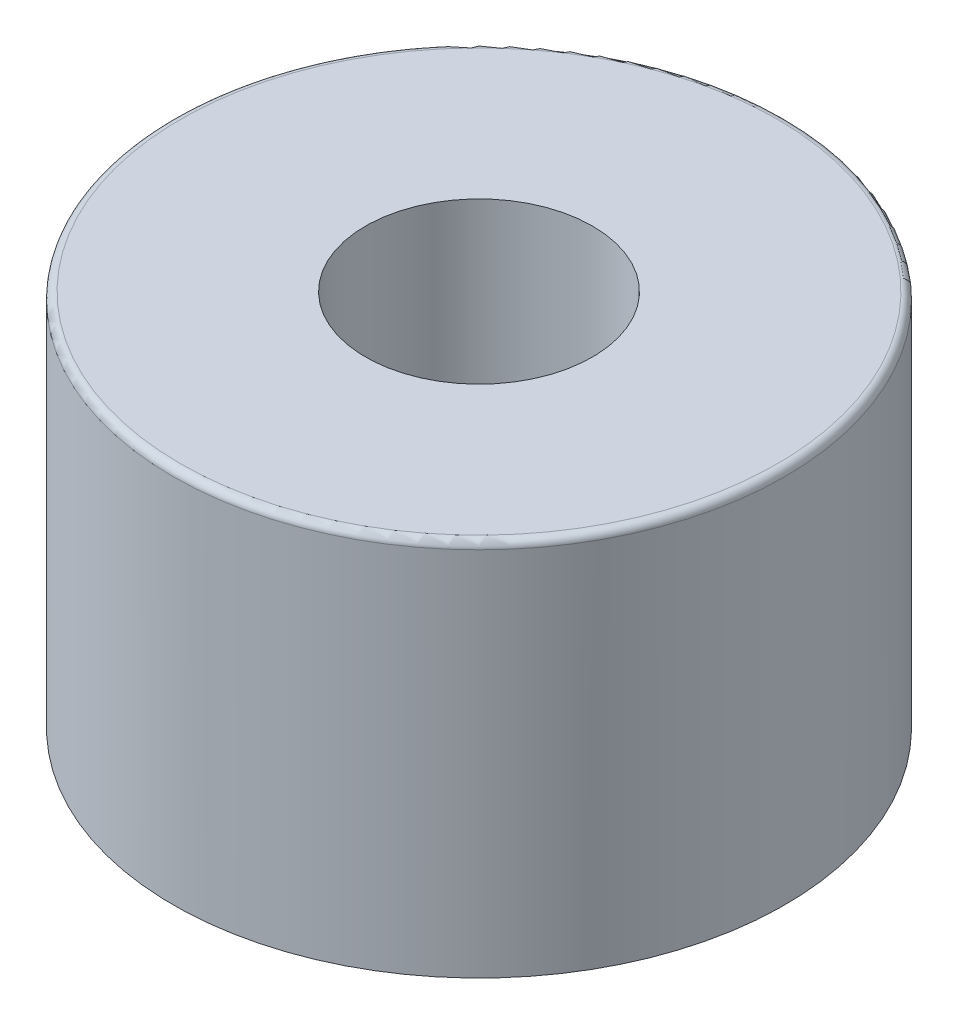
ISO-10303-21;
HEADER;
FILE_DESCRIPTION(('STEP AP214'),'2;1');
FILE_NAME('part.step','',(''),(''),'','','');
FILE_SCHEMA(('AUTOMOTIVE_DESIGN { 1 0 10303 214 1 1 1 1 }'));
ENDSEC;
DATA;
#1=APPLICATION_CONTEXT('core data for automotive mechanical design processes');
#2=APPLICATION_PROTOCOL_DEFINITION('international standard','automotive_design',2000,#1);
#3=PRODUCT_CONTEXT('',#1,'mechanical');
#4=PRODUCT('Part','Part','',(#3));
#5=PRODUCT_RELATED_PRODUCT_CATEGORY('part','',(#4));
#6=PRODUCT_DEFINITION_FORMATION('','',#4);
#7=PRODUCT_DEFINITION_CONTEXT('part definition',#1,'design');
#8=PRODUCT_DEFINITION('design','',#6,#7);
#9=PRODUCT_DEFINITION_SHAPE('','',#8);
#10=(LENGTH_UNIT() NAMED_UNIT(*) SI_UNIT(.MILLI.,.METRE.));
#11=(NAMED_UNIT(*) PLANE_ANGLE_UNIT() SI_UNIT($,.RADIAN.));
#12=(NAMED_UNIT(*) SI_UNIT($,.STERADIAN.) SOLID_ANGLE_UNIT());
#13=UNCERTAINTY_MEASURE_WITH_UNIT(LENGTH_MEASURE(1.E-05),#10,'distance_accuracy_value','');
#14=(GEOMETRIC_REPRESENTATION_CONTEXT(3) GLOBAL_UNCERTAINTY_ASSIGNED_CONTEXT((#13)) GLOBAL_UNIT_ASSIGNED_CONTEXT((#10,
#11,#12)) REPRESENTATION_CONTEXT('',''));
#15=CARTESIAN_POINT('',(0.,0.,0.));
#16=DIRECTION('',(0.,0.,1.));
#17=DIRECTION('',(1.,0.,0.));
#18=AXIS2_PLACEMENT_3D('',#15,#16,#17);
#19=CARTESIAN_POINT('',(0.,15.24,0.));
#20=DIRECTION('',(0.,1.,0.));
#21=DIRECTION('',(0.,0.,1.));
#22=AXIS2_PLACEMENT_3D('',#19,#20,#21);
#23=PLANE('',#22);
#24=CARTESIAN_POINT('',(0.,15.24,0.));
#25=DIRECTION('',(0.,1.,0.));
#26=DIRECTION('',(0.,0.,1.));
#27=AXIS2_PLACEMENT_3D('',#24,#25,#26);
#28=CIRCLE('',#27,12.019);
#29=CARTESIAN_POINT('',(0.,15.24,12.019));
#30=VERTEX_POINT('',#29);
#31=EDGE_CURVE('E39',#30,#30,#28,.T.);
#32=ORIENTED_EDGE('',*,*,#31,.T.);
#33=EDGE_LOOP('',(#32));
#34=FACE_BOUND('',#33,.T.);
#35=CARTESIAN_POINT('',(0.,15.24,0.));
#36=DIRECTION('',(0.,1.,0.));
#37=DIRECTION('',(0.,0.,1.));
#38=AXIS2_PLACEMENT_3D('',#35,#36,#37);
#39=CIRCLE('',#38,4.572);
#40=CARTESIAN_POINT('',(0.,15.24,-4.572));
#41=VERTEX_POINT('',#40);
#42=EDGE_CURVE('E47',#41,#41,#39,.T.);
#43=ORIENTED_EDGE('',*,*,#42,.F.);
#44=EDGE_LOOP('',(#43));
#45=FACE_BOUND('',#44,.T.);
#46=ADVANCED_FACE('F32',(#34,#45),#23,.T.);
#47=CARTESIAN_POINT('',(0.,0.,0.));
#48=DIRECTION('',(0.,1.,0.));
#49=DIRECTION('',(0.,0.,1.));
#50=AXIS2_PLACEMENT_3D('',#47,#48,#49);
#51=PLANE('',#50);
#52=CARTESIAN_POINT('',(0.,0.,0.));
#53=DIRECTION('',(0.,1.,0.));
#54=DIRECTION('',(0.,0.,1.));
#55=AXIS2_PLACEMENT_3D('',#52,#53,#54);
#56=CIRCLE('',#55,12.319);
#57=CARTESIAN_POINT('',(0.,0.,-12.319));
#58=VERTEX_POINT('',#57);
#59=EDGE_CURVE('E43',#58,#58,#56,.T.);
#60=ORIENTED_EDGE('',*,*,#59,.F.);
#61=EDGE_LOOP('',(#60));
#62=FACE_BOUND('',#61,.T.);
#63=CARTESIAN_POINT('',(0.,0.,0.));
#64=DIRECTION('',(0.,1.,0.));
#65=DIRECTION('',(0.,0.,1.));
#66=AXIS2_PLACEMENT_3D('',#63,#64,#65);
#67=CIRCLE('',#66,4.572);
#68=CARTESIAN_POINT('',(0.,0.,-4.572));
#69=VERTEX_POINT('',#68);
#70=EDGE_CURVE('E50',#69,#69,#67,.T.);
#71=ORIENTED_EDGE('',*,*,#70,.T.);
#72=EDGE_LOOP('',(#71));
#73=FACE_BOUND('',#72,.T.);
#74=ADVANCED_FACE('F60',(#62,#73),#51,.F.);
#75=CARTESIAN_POINT('',(0.,15.24,0.));
#76=DIRECTION('',(0.,-1.,0.));
#77=DIRECTION('',(0.,0.,-1.));
#78=AXIS2_PLACEMENT_3D('',#75,#76,#77);
#79=CYLINDRICAL_SURFACE('',#78,12.319);
#80=CARTESIAN_POINT('',(0.,14.94,0.));
#81=DIRECTION('',(0.,1.,0.));
#82=DIRECTION('',(0.,0.,1.));
#83=AXIS2_PLACEMENT_3D('',#80,#81,#82);
#84=CIRCLE('',#83,12.319);
#85=CARTESIAN_POINT('',(0.,14.94,-12.319));
#86=VERTEX_POINT('',#85);
#87=EDGE_CURVE('E10',#86,#86,#84,.F.);
#88=CARTESIAN_POINT('',(0.,14.94,-12.319));
#89=CARTESIAN_POINT('',(0.,14.784375,-12.319));
#90=CARTESIAN_POINT('',(0.,14.62875,-12.319));
#91=CARTESIAN_POINT('',(0.,14.3175,-12.319));
#92=CARTESIAN_POINT('',(0.,14.161875,-12.319));
#93=CARTESIAN_POINT('',(0.,13.850625,-12.319));
#94=CARTESIAN_POINT('',(0.,13.695,-12.319));
#95=CARTESIAN_POINT('',(0.,13.38375,-12.319));
#96=CARTESIAN_POINT('',(0.,13.228125,-12.319));
#97=CARTESIAN_POINT('',(0.,12.916875,-12.319));
#98=CARTESIAN_POINT('',(0.,12.76125,-12.319));
#99=CARTESIAN_POINT('',(0.,12.45,-12.319));
#100=CARTESIAN_POINT('',(0.,12.294375,-12.319));
#101=CARTESIAN_POINT('',(0.,11.983125,-12.319));
#102=CARTESIAN_POINT('',(0.,11.8275,-12.319));
#103=CARTESIAN_POINT('',(0.,11.51625,-12.319));
#104=CARTESIAN_POINT('',(0.,11.360625,-12.319));
#105=CARTESIAN_POINT('',(0.,11.049375,-12.319));
#106=CARTESIAN_POINT('',(0.,10.89375,-12.319));
#107=CARTESIAN_POINT('',(0.,10.5825,-12.319));
#108=CARTESIAN_POINT('',(0.,10.426875,-12.319));
#109=CARTESIAN_POINT('',(0.,10.115625,-12.319));
#110=CARTESIAN_POINT('',(0.,9.96,-12.319));
#111=CARTESIAN_POINT('',(0.,9.64875,-12.319));
#112=CARTESIAN_POINT('',(0.,9.493125,-12.319));
#113=CARTESIAN_POINT('',(0.,9.181875,-12.319));
#114=CARTESIAN_POINT('',(0.,9.02625,-12.319));
#115=CARTESIAN_POINT('',(0.,8.715,-12.319));
#116=CARTESIAN_POINT('',(0.,8.559375,-12.319));
#117=CARTESIAN_POINT('',(0.,8.248125,-12.319));
#118=CARTESIAN_POINT('',(0.,8.0925,-12.319));
#119=CARTESIAN_POINT('',(0.,7.78125,-12.319));
#120=CARTESIAN_POINT('',(0.,7.625625,-12.319));
#121=CARTESIAN_POINT('',(0.,7.314375,-12.319));
#122=CARTESIAN_POINT('',(0.,7.15875,-12.319));
#123=CARTESIAN_POINT('',(0.,6.8475,-12.319));
#124=CARTESIAN_POINT('',(0.,6.691875,-12.319));
#125=CARTESIAN_POINT('',(0.,6.380625,-12.319));
#126=CARTESIAN_POINT('',(0.,6.225,-12.319));
#127=CARTESIAN_POINT('',(0.,5.91375,-12.319));
#128=CARTESIAN_POINT('',(0.,5.758125,-12.319));
#129=CARTESIAN_POINT('',(0.,5.446875,-12.319));
#130=CARTESIAN_POINT('',(0.,5.29125,-12.319));
#131=CARTESIAN_POINT('',(0.,4.98,-12.319));
#132=CARTESIAN_POINT('',(0.,4.824375,-12.319));
#133=CARTESIAN_POINT('',(0.,4.513125,-12.319));
#134=CARTESIAN_POINT('',(0.,4.3575,-12.319));
#135=CARTESIAN_POINT('',(0.,4.04625,-12.319));
#136=CARTESIAN_POINT('',(0.,3.890625,-12.319));
#137=CARTESIAN_POINT('',(0.,3.579375,-12.319));
#138=CARTESIAN_POINT('',(0.,3.42375,-12.319));
#139=CARTESIAN_POINT('',(0.,3.1125,-12.319));
#140=CARTESIAN_POINT('',(0.,2.956875,-12.319));
#141=CARTESIAN_POINT('',(0.,2.645625,-12.319));
#142=CARTESIAN_POINT('',(0.,2.49,-12.319));
#143=CARTESIAN_POINT('',(0.,2.17875,-12.319));
#144=CARTESIAN_POINT('',(0.,2.023125,-12.319));
#145=CARTESIAN_POINT('',(0.,1.711875,-12.319));
#146=CARTESIAN_POINT('',(0.,1.55625,-12.319));
#147=CARTESIAN_POINT('',(0.,1.245,-12.319));
#148=CARTESIAN_POINT('',(0.,1.089375,-12.319));
#149=CARTESIAN_POINT('',(0.,0.778125,-12.319));
#150=CARTESIAN_POINT('',(0.,0.6225,-12.319));
#151=CARTESIAN_POINT('',(0.,0.31125,-12.319));
#152=CARTESIAN_POINT('',(0.,0.155625,-12.319));
#153=CARTESIAN_POINT('',(0.,0.,-12.319));
#154=B_SPLINE_CURVE_WITH_KNOTS('',3,(#88,#89,#90,#91,#92,#93,#94,#95,#96,#97,#98,#99,#100,#101,
#102,#103,#104,#105,#106,#107,#108,#109,#110,#111,#112,#113,#114,#115,#116,#117,#118,#119,#120,
#121,#122,#123,#124,#125,#126,#127,#128,#129,#130,#131,#132,#133,#134,#135,#136,#137,#138,#139,
#140,#141,#142,#143,#144,#145,#146,#147,#148,#149,#150,#151,#152,#153),.UNSPECIFIED.,.F.,.F.,(4,
2,2,2,2,2,2,2,2,2,2,2,2,2,2,2,2,2,2,2,2,2,2,2,2,2,2,2,2,2,2,2,4),(0.,0.466874999999999,
0.933749999999999,1.400625,1.8675,2.334375,2.80125,3.268125,3.735,4.201875,4.66875,5.135625,
5.6025,6.069375,6.53625,7.003125,7.47,7.936875,8.40375,8.870625,9.3375,9.804375,10.27125,
10.738125,11.205,11.671875,12.13875,12.605625,13.0725,13.539375,14.00625,14.473125,14.94),.UNSPECIFIED.);
#155=EDGE_CURVE('BSEAM65',#86,#58,#154,.T.);
#156=ORIENTED_EDGE('',*,*,#87,.T.);
#157=ORIENTED_EDGE('',*,*,#59,.T.);
#158=ORIENTED_EDGE('',*,*,#155,.T.);
#159=ORIENTED_EDGE('',*,*,#155,.F.);
#160=EDGE_LOOP('',(#156,#158,#157,#159));
#161=FACE_BOUND('',#160,.T.);
#162=ADVANCED_FACE('F65',(#161),#79,.T.);
#163=CARTESIAN_POINT('',(0.,15.24,0.));
#164=DIRECTION('',(0.,-1.,0.));
#165=DIRECTION('',(0.,0.,-1.));
#166=AXIS2_PLACEMENT_3D('',#163,#164,#165);
#167=CYLINDRICAL_SURFACE('',#166,4.572);
#168=CARTESIAN_POINT('',(0.,15.24,-4.572));
#169=CARTESIAN_POINT('',(0.,15.08125,-4.572));
#170=CARTESIAN_POINT('',(0.,14.9225,-4.572));
#171=CARTESIAN_POINT('',(0.,14.605,-4.572));
#172=CARTESIAN_POINT('',(0.,14.44625,-4.572));
#173=CARTESIAN_POINT('',(0.,14.12875,-4.572));
#174=CARTESIAN_POINT('',(0.,13.97,-4.572));
#175=CARTESIAN_POINT('',(0.,13.6525,-4.572));
#176=CARTESIAN_POINT('',(0.,13.49375,-4.572));
#177=CARTESIAN_POINT('',(0.,13.17625,-4.572));
#178=CARTESIAN_POINT('',(0.,13.0175,-4.572));
#179=CARTESIAN_POINT('',(0.,12.7,-4.572));
#180=CARTESIAN_POINT('',(0.,12.54125,-4.572));
#181=CARTESIAN_POINT('',(0.,12.22375,-4.572));
#182=CARTESIAN_POINT('',(0.,12.065,-4.572));
#183=CARTESIAN_POINT('',(0.,11.7475,-4.572));
#184=CARTESIAN_POINT('',(0.,11.58875,-4.572));
#185=CARTESIAN_POINT('',(0.,11.27125,-4.572));
#186=CARTESIAN_POINT('',(0.,11.1125,-4.572));
#187=CARTESIAN_POINT('',(0.,10.795,-4.572));
#188=CARTESIAN_POINT('',(0.,10.63625,-4.572));
#189=CARTESIAN_POINT('',(0.,10.31875,-4.572));
#190=CARTESIAN_POINT('',(0.,10.16,-4.572));
#191=CARTESIAN_POINT('',(0.,9.8425,-4.572));
#192=CARTESIAN_POINT('',(0.,9.68375,-4.572));
#193=CARTESIAN_POINT('',(0.,9.36625,-4.572));
#194=CARTESIAN_POINT('',(0.,9.2075,-4.572));
#195=CARTESIAN_POINT('',(0.,8.89,-4.572));
#196=CARTESIAN_POINT('',(0.,8.73125,-4.572));
#197=CARTESIAN_POINT('',(0.,8.41375,-4.572));
#198=CARTESIAN_POINT('',(0.,8.255,-4.572));
#199=CARTESIAN_POINT('',(0.,7.9375,-4.572));
#200=CARTESIAN_POINT('',(0.,7.77875,-4.572));
#201=CARTESIAN_POINT('',(0.,7.46125,-4.572));
#202=CARTESIAN_POINT('',(0.,7.3025,-4.572));
#203=CARTESIAN_POINT('',(0.,6.985,-4.572));
#204=CARTESIAN_POINT('',(0.,6.82625,-4.572));
#205=CARTESIAN_POINT('',(0.,6.50875,-4.572));
#206=CARTESIAN_POINT('',(0.,6.35,-4.572));
#207=CARTESIAN_POINT('',(0.,6.0325,-4.572));
#208=CARTESIAN_POINT('',(0.,5.87375,-4.572));
#209=CARTESIAN_POINT('',(0.,5.55625,-4.572));
#210=CARTESIAN_POINT('',(0.,5.3975,-4.572));
#211=CARTESIAN_POINT('',(0.,5.08,-4.572));
#212=CARTESIAN_POINT('',(0.,4.92125,-4.572));
#213=CARTESIAN_POINT('',(0.,4.60375,-4.572));
#214=CARTESIAN_POINT('',(0.,4.445,-4.572));
#215=CARTESIAN_POINT('',(0.,4.1275,-4.572));
#216=CARTESIAN_POINT('',(0.,3.96875,-4.572));
#217=CARTESIAN_POINT('',(0.,3.65125,-4.572));
#218=CARTESIAN_POINT('',(0.,3.4925,-4.572));
#219=CARTESIAN_POINT('',(0.,3.175,-4.572));
#220=CARTESIAN_POINT('',(0.,3.01625,-4.572));
#221=CARTESIAN_POINT('',(0.,2.69875,-4.572));
#222=CARTESIAN_POINT('',(0.,2.54,-4.572));
#223=CARTESIAN_POINT('',(0.,2.2225,-4.572));
#224=CARTESIAN_POINT('',(0.,2.06375,-4.572));
#225=CARTESIAN_POINT('',(0.,1.74625,-4.572));
#226=CARTESIAN_POINT('',(0.,1.5875,-4.572));
#227=CARTESIAN_POINT('',(0.,1.27,-4.572));
#228=CARTESIAN_POINT('',(0.,1.11125,-4.572));
#229=CARTESIAN_POINT('',(0.,0.79375,-4.572));
#230=CARTESIAN_POINT('',(0.,0.634999999999999,-4.572));
#231=CARTESIAN_POINT('',(0.,0.3175,-4.572));
#232=CARTESIAN_POINT('',(0.,0.15875,-4.572));
#233=CARTESIAN_POINT('',(0.,0.,-4.572));
#234=B_SPLINE_CURVE_WITH_KNOTS('',3,(#168,#169,#170,#171,#172,#173,#174,#175,#176,#177,#178,
#179,#180,#181,#182,#183,#184,#185,#186,#187,#188,#189,#190,#191,#192,#193,#194,#195,#196,#197,
#198,#199,#200,#201,#202,#203,#204,#205,#206,#207,#208,#209,#210,#211,#212,#213,#214,#215,#216,
#217,#218,#219,#220,#221,#222,#223,#224,#225,#226,#227,#228,#229,#230,#231,#232,#233),
.UNSPECIFIED.,.F.,.F.,(4,2,2,2,2,2,2,2,2,2,2,2,2,2,2,2,2,2,2,2,2,2,2,2,2,2,2,2,2,2,2,2,4),(0.,
0.476250000000001,0.9525,1.42875,1.905,2.38125,2.8575,3.33375,3.81,4.28625,4.7625,5.23875,5.715,
6.19125,6.6675,7.14375,7.62,8.09625,8.5725,9.04875,9.525,10.00125,10.4775,10.95375,11.43,
11.90625,12.3825,12.85875,13.335,13.81125,14.2875,14.76375,15.24),.UNSPECIFIED.);
#235=EDGE_CURVE('BSEAM56',#41,#69,#234,.T.);
#236=ORIENTED_EDGE('',*,*,#42,.T.);
#237=ORIENTED_EDGE('',*,*,#70,.F.);
#238=ORIENTED_EDGE('',*,*,#235,.T.);
#239=ORIENTED_EDGE('',*,*,#235,.F.);
#240=EDGE_LOOP('',(#236,#238,#237,#239));
#241=FACE_BOUND('',#240,.T.);
#242=ADVANCED_FACE('F56',(#241),#167,.F.);
#243=CARTESIAN_POINT('',(0.,14.94,0.));
#244=DIRECTION('',(0.,1.,0.));
#245=DIRECTION('',(0.,0.,1.));
#246=AXIS2_PLACEMENT_3D('',#243,#244,#245);
#247=TOROIDAL_SURFACE('',#246,12.019,0.3);
#248=ORIENTED_EDGE('',*,*,#87,.F.);
#249=EDGE_LOOP('',(#248));
#250=FACE_BOUND('',#249,.T.);
#251=ORIENTED_EDGE('',*,*,#31,.F.);
#252=EDGE_LOOP('',(#251));
#253=FACE_BOUND('',#252,.T.);
#254=ADVANCED_FACE('F34',(#250,#253),#247,.T.);
#255=CLOSED_SHELL('',(#46,#74,#162,#242,#254));
#256=MANIFOLD_SOLID_BREP('B2',#255);
#257=ADVANCED_BREP_SHAPE_REPRESENTATION('',(#18,#256),#14);
#258=SHAPE_DEFINITION_REPRESENTATION(#9,#257);
ENDSEC;
END-ISO-10303-21;
